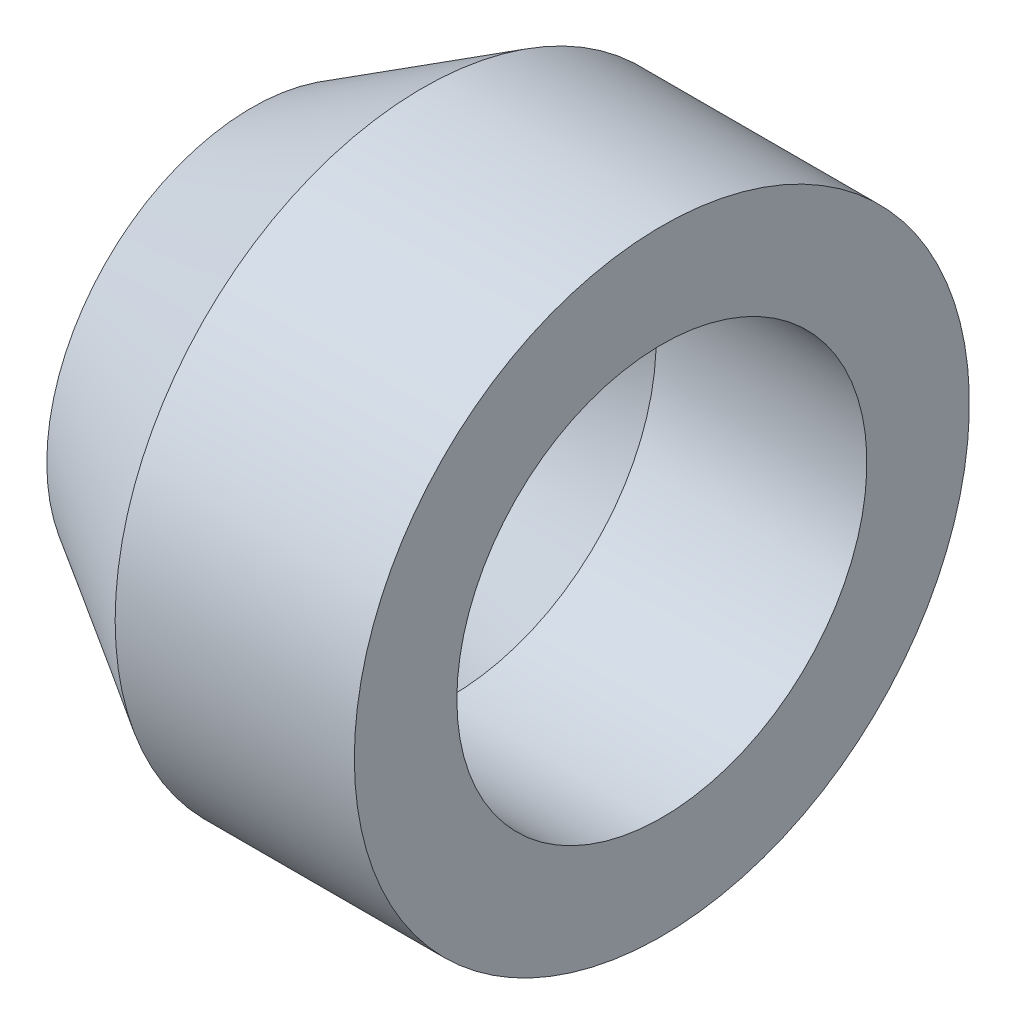
ISO-10303-21;
HEADER;
FILE_DESCRIPTION(('STEP AP214'),'2;1');
FILE_NAME('part.step','',(''),(''),'','','');
FILE_SCHEMA(('AUTOMOTIVE_DESIGN { 1 0 10303 214 1 1 1 1 }'));
ENDSEC;
DATA;
#1=APPLICATION_CONTEXT('core data for automotive mechanical design processes');
#2=APPLICATION_PROTOCOL_DEFINITION('international standard','automotive_design',2000,#1);
#3=PRODUCT_CONTEXT('',#1,'mechanical');
#4=PRODUCT('Part','Part','',(#3));
#5=PRODUCT_RELATED_PRODUCT_CATEGORY('part','',(#4));
#6=PRODUCT_DEFINITION_FORMATION('','',#4);
#7=PRODUCT_DEFINITION_CONTEXT('part definition',#1,'design');
#8=PRODUCT_DEFINITION('design','',#6,#7);
#9=PRODUCT_DEFINITION_SHAPE('','',#8);
#10=(LENGTH_UNIT() NAMED_UNIT(*) SI_UNIT(.MILLI.,.METRE.));
#11=(NAMED_UNIT(*) PLANE_ANGLE_UNIT() SI_UNIT($,.RADIAN.));
#12=(NAMED_UNIT(*) SI_UNIT($,.STERADIAN.) SOLID_ANGLE_UNIT());
#13=UNCERTAINTY_MEASURE_WITH_UNIT(LENGTH_MEASURE(1.E-05),#10,'distance_accuracy_value','');
#14=(GEOMETRIC_REPRESENTATION_CONTEXT(3) GLOBAL_UNCERTAINTY_ASSIGNED_CONTEXT((#13)) GLOBAL_UNIT_ASSIGNED_CONTEXT((#10,
#11,#12)) REPRESENTATION_CONTEXT('',''));
#15=CARTESIAN_POINT('',(0.,0.,0.));
#16=DIRECTION('',(0.,0.,1.));
#17=DIRECTION('',(1.,0.,0.));
#18=AXIS2_PLACEMENT_3D('',#15,#16,#17);
#19=CARTESIAN_POINT('',(-9.,-6.91364246066136,0.));
#20=DIRECTION('',(1.,0.,0.));
#21=DIRECTION('',(0.,0.,-1.));
#22=AXIS2_PLACEMENT_3D('',#19,#20,#21);
#23=PLANE('',#22);
#24=CARTESIAN_POINT('',(-9.,0.,0.));
#25=DIRECTION('',(-1.,0.,0.));
#26=DIRECTION('',(0.,0.,1.));
#27=AXIS2_PLACEMENT_3D('',#24,#25,#26);
#28=CIRCLE('',#27,4.30142886309282);
#29=CARTESIAN_POINT('',(-9.,0.,4.30142886309282));
#30=VERTEX_POINT('',#29);
#31=EDGE_CURVE('E10',#30,#30,#28,.T.);
#32=ORIENTED_EDGE('',*,*,#31,.F.);
#33=EDGE_LOOP('',(#32));
#34=FACE_BOUND('',#33,.T.);
#35=ADVANCED_FACE('F30',(#34),#23,.T.);
#36=CARTESIAN_POINT('',(-6.1690481051547,0.,0.));
#37=DIRECTION('',(1.,0.,0.));
#38=DIRECTION('',(0.,0.,-1.));
#39=AXIS2_PLACEMENT_3D('',#36,#37,#38);
#40=CONICAL_SURFACE('',#39,6.,0.540419500270583);
#41=ORIENTED_EDGE('',*,*,#31,.T.);
#42=EDGE_LOOP('',(#41));
#43=FACE_BOUND('',#42,.T.);
#44=CARTESIAN_POINT('',(-6.1690481051547,0.,0.));
#45=DIRECTION('',(-1.,0.,0.));
#46=DIRECTION('',(0.,0.,1.));
#47=AXIS2_PLACEMENT_3D('',#44,#45,#46);
#48=CIRCLE('',#47,6.);
#49=CARTESIAN_POINT('',(-6.1690481051547,0.,6.));
#50=VERTEX_POINT('',#49);
#51=EDGE_CURVE('E36',#50,#50,#48,.T.);
#52=ORIENTED_EDGE('',*,*,#51,.F.);
#53=EDGE_LOOP('',(#52));
#54=FACE_BOUND('',#53,.T.);
#55=ADVANCED_FACE('F78',(#43,#54),#40,.F.);
#56=CARTESIAN_POINT('',(-27.6912331788712,0.,0.));
#57=DIRECTION('',(-1.,0.,0.));
#58=DIRECTION('',(0.,0.,1.));
#59=AXIS2_PLACEMENT_3D('',#56,#57,#58);
#60=CYLINDRICAL_SURFACE('',#59,6.);
#61=CARTESIAN_POINT('',(0.,0.,0.));
#62=DIRECTION('',(-1.,0.,0.));
#63=DIRECTION('',(0.,0.,1.));
#64=AXIS2_PLACEMENT_3D('',#61,#62,#63);
#65=CIRCLE('',#64,6.);
#66=CARTESIAN_POINT('',(0.,0.,6.));
#67=VERTEX_POINT('',#66);
#68=EDGE_CURVE('E40',#67,#67,#65,.T.);
#69=ORIENTED_EDGE('',*,*,#68,.F.);
#70=EDGE_LOOP('',(#69));
#71=FACE_BOUND('',#70,.T.);
#72=ORIENTED_EDGE('',*,*,#51,.T.);
#73=EDGE_LOOP('',(#72));
#74=FACE_BOUND('',#73,.T.);
#75=ADVANCED_FACE('F73',(#71,#74),#60,.F.);
#76=CARTESIAN_POINT('',(0.,-6.91364246066136,0.));
#77=DIRECTION('',(-1.,0.,0.));
#78=DIRECTION('',(0.,0.,1.));
#79=AXIS2_PLACEMENT_3D('',#76,#77,#78);
#80=PLANE('',#79);
#81=CARTESIAN_POINT('',(0.,0.,0.));
#82=DIRECTION('',(-1.,0.,0.));
#83=DIRECTION('',(0.,0.,1.));
#84=AXIS2_PLACEMENT_3D('',#81,#82,#83);
#85=CIRCLE('',#84,9.);
#86=CARTESIAN_POINT('',(0.,0.,9.));
#87=VERTEX_POINT('',#86);
#88=EDGE_CURVE('E44',#87,#87,#85,.T.);
#89=ORIENTED_EDGE('',*,*,#88,.F.);
#90=EDGE_LOOP('',(#89));
#91=FACE_BOUND('',#90,.T.);
#92=ORIENTED_EDGE('',*,*,#68,.T.);
#93=EDGE_LOOP('',(#92));
#94=FACE_BOUND('',#93,.T.);
#95=ADVANCED_FACE('F67',(#91,#94),#80,.F.);
#96=CARTESIAN_POINT('',(-27.6912331788712,0.,0.));
#97=DIRECTION('',(-1.,0.,0.));
#98=DIRECTION('',(0.,0.,1.));
#99=AXIS2_PLACEMENT_3D('',#96,#97,#98);
#100=CYLINDRICAL_SURFACE('',#99,9.);
#101=CARTESIAN_POINT('',(-7.,0.,0.));
#102=DIRECTION('',(-1.,0.,0.));
#103=DIRECTION('',(0.,0.,1.));
#104=AXIS2_PLACEMENT_3D('',#101,#102,#103);
#105=CIRCLE('',#104,9.);
#106=CARTESIAN_POINT('',(-7.,0.,9.));
#107=VERTEX_POINT('',#106);
#108=EDGE_CURVE('E49',#107,#107,#105,.T.);
#109=ORIENTED_EDGE('',*,*,#108,.F.);
#110=EDGE_LOOP('',(#109));
#111=FACE_BOUND('',#110,.T.);
#112=ORIENTED_EDGE('',*,*,#88,.T.);
#113=EDGE_LOOP('',(#112));
#114=FACE_BOUND('',#113,.T.);
#115=ADVANCED_FACE('F61',(#111,#114),#100,.T.);
#116=CARTESIAN_POINT('',(-7.,0.,0.));
#117=DIRECTION('',(1.,0.,0.));
#118=DIRECTION('',(0.,0.,-1.));
#119=AXIS2_PLACEMENT_3D('',#116,#117,#118);
#120=CONICAL_SURFACE('',#119,9.,0.540419500270585);
#121=CARTESIAN_POINT('',(-12.,0.,0.));
#122=DIRECTION('',(-1.,0.,0.));
#123=DIRECTION('',(0.,0.,1.));
#124=AXIS2_PLACEMENT_3D('',#121,#122,#123);
#125=CIRCLE('',#124,5.99999999999999);
#126=CARTESIAN_POINT('',(-12.,0.,5.99999999999999));
#127=VERTEX_POINT('',#126);
#128=EDGE_CURVE('E52',#127,#127,#125,.T.);
#129=ORIENTED_EDGE('',*,*,#128,.F.);
#130=EDGE_LOOP('',(#129));
#131=FACE_BOUND('',#130,.T.);
#132=ORIENTED_EDGE('',*,*,#108,.T.);
#133=EDGE_LOOP('',(#132));
#134=FACE_BOUND('',#133,.T.);
#135=ADVANCED_FACE('F58',(#131,#134),#120,.T.);
#136=CARTESIAN_POINT('',(-12.,-6.91364246066136,0.));
#137=DIRECTION('',(1.,0.,0.));
#138=DIRECTION('',(0.,0.,-1.));
#139=AXIS2_PLACEMENT_3D('',#136,#137,#138);
#140=PLANE('',#139);
#141=ORIENTED_EDGE('',*,*,#128,.T.);
#142=EDGE_LOOP('',(#141));
#143=FACE_BOUND('',#142,.T.);
#144=ADVANCED_FACE('F56',(#143),#140,.F.);
#145=CLOSED_SHELL('',(#35,#55,#75,#95,#115,#135,#144));
#146=MANIFOLD_SOLID_BREP('B2',#145);
#147=ADVANCED_BREP_SHAPE_REPRESENTATION('',(#18,#146),#14);
#148=SHAPE_DEFINITION_REPRESENTATION(#9,#147);
ENDSEC;
END-ISO-10303-21;
